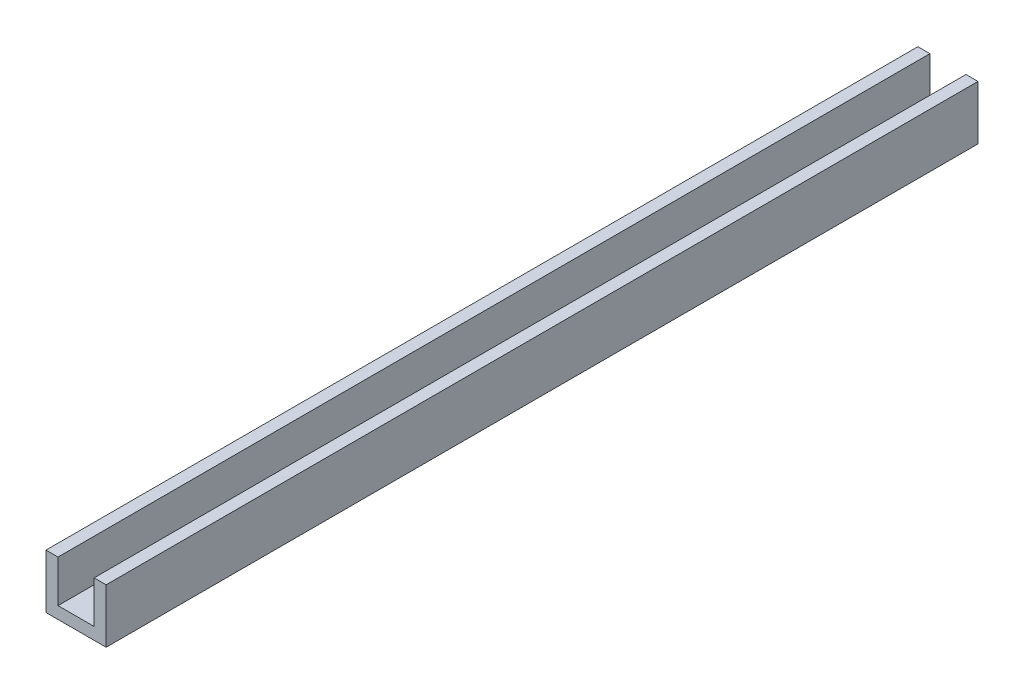
ISO-10303-21;
HEADER;
FILE_DESCRIPTION(('STEP AP214'),'2;1');
FILE_NAME('part.step','',(''),(''),'','','');
FILE_SCHEMA(('AUTOMOTIVE_DESIGN { 1 0 10303 214 1 1 1 1 }'));
ENDSEC;
DATA;
#1=APPLICATION_CONTEXT('core data for automotive mechanical design processes');
#2=APPLICATION_PROTOCOL_DEFINITION('international standard','automotive_design',2000,#1);
#3=PRODUCT_CONTEXT('',#1,'mechanical');
#4=PRODUCT('Part','Part','',(#3));
#5=PRODUCT_RELATED_PRODUCT_CATEGORY('part','',(#4));
#6=PRODUCT_DEFINITION_FORMATION('','',#4);
#7=PRODUCT_DEFINITION_CONTEXT('part definition',#1,'design');
#8=PRODUCT_DEFINITION('design','',#6,#7);
#9=PRODUCT_DEFINITION_SHAPE('','',#8);
#10=(LENGTH_UNIT() NAMED_UNIT(*) SI_UNIT(.MILLI.,.METRE.));
#11=(NAMED_UNIT(*) PLANE_ANGLE_UNIT() SI_UNIT($,.RADIAN.));
#12=(NAMED_UNIT(*) SI_UNIT($,.STERADIAN.) SOLID_ANGLE_UNIT());
#13=UNCERTAINTY_MEASURE_WITH_UNIT(LENGTH_MEASURE(1.E-05),#10,'distance_accuracy_value','');
#14=(GEOMETRIC_REPRESENTATION_CONTEXT(3) GLOBAL_UNCERTAINTY_ASSIGNED_CONTEXT((#13)) GLOBAL_UNIT_ASSIGNED_CONTEXT((#10,
#11,#12)) REPRESENTATION_CONTEXT('',''));
#15=CARTESIAN_POINT('',(0.,0.,0.));
#16=DIRECTION('',(0.,0.,1.));
#17=DIRECTION('',(1.,0.,0.));
#18=AXIS2_PLACEMENT_3D('',#15,#16,#17);
#19=CARTESIAN_POINT('',(-3.,9.,245.));
#20=DIRECTION('',(0.,-1.,0.));
#21=DIRECTION('',(0.,0.,-1.));
#22=AXIS2_PLACEMENT_3D('',#19,#20,#21);
#23=PLANE('',#22);
#24=DIRECTION('',(0.,0.,-1.));
#25=VECTOR('',#24,1.);
#26=CARTESIAN_POINT('',(-3.,9.,245.));
#27=LINE('',#26,#25);
#28=CARTESIAN_POINT('',(-3.,9.,245.));
#29=VERTEX_POINT('',#28);
#30=CARTESIAN_POINT('',(-3.,9.,100.));
#31=VERTEX_POINT('',#30);
#32=EDGE_CURVE('E175',#29,#31,#27,.T.);
#33=ORIENTED_EDGE('',*,*,#32,.T.);
#34=DIRECTION('',(-1.,0.,0.));
#35=VECTOR('',#34,1.);
#36=CARTESIAN_POINT('',(-5.00000000000001,9.,100.));
#37=LINE('',#36,#35);
#38=CARTESIAN_POINT('',(-5.00000000000001,9.,100.));
#39=VERTEX_POINT('',#38);
#40=EDGE_CURVE('E51',#31,#39,#37,.T.);
#41=ORIENTED_EDGE('',*,*,#40,.T.);
#42=DIRECTION('',(0.,0.,-1.));
#43=VECTOR('',#42,1.);
#44=CARTESIAN_POINT('',(-5.,9.,245.));
#45=LINE('',#44,#43);
#46=CARTESIAN_POINT('',(-5.,9.,245.));
#47=VERTEX_POINT('',#46);
#48=EDGE_CURVE('E44',#47,#39,#45,.T.);
#49=ORIENTED_EDGE('',*,*,#48,.F.);
#50=DIRECTION('',(-1.,0.,0.));
#51=VECTOR('',#50,1.);
#52=CARTESIAN_POINT('',(-3.,9.,245.));
#53=LINE('',#52,#51);
#54=EDGE_CURVE('E153',#29,#47,#53,.T.);
#55=ORIENTED_EDGE('',*,*,#54,.F.);
#56=EDGE_LOOP('',(#33,#41,#49,#55));
#57=FACE_BOUND('',#56,.T.);
#58=ADVANCED_FACE('F37',(#57),#23,.F.);
#59=CARTESIAN_POINT('',(-5.,9.,245.));
#60=DIRECTION('',(1.,0.,0.));
#61=DIRECTION('',(0.,1.,0.));
#62=AXIS2_PLACEMENT_3D('',#59,#60,#61);
#63=PLANE('',#62);
#64=ORIENTED_EDGE('',*,*,#48,.T.);
#65=DIRECTION('',(0.,-1.,0.));
#66=VECTOR('',#65,1.);
#67=CARTESIAN_POINT('',(-5.00000000000001,9.,100.));
#68=LINE('',#67,#66);
#69=CARTESIAN_POINT('',(-5.00000000000001,0.,100.));
#70=VERTEX_POINT('',#69);
#71=EDGE_CURVE('E120',#39,#70,#68,.T.);
#72=ORIENTED_EDGE('',*,*,#71,.T.);
#73=DIRECTION('',(0.,0.,-1.));
#74=VECTOR('',#73,1.);
#75=CARTESIAN_POINT('',(-5.,0.,245.));
#76=LINE('',#75,#74);
#77=CARTESIAN_POINT('',(-5.,0.,245.));
#78=VERTEX_POINT('',#77);
#79=EDGE_CURVE('E126',#78,#70,#76,.T.);
#80=ORIENTED_EDGE('',*,*,#79,.F.);
#81=DIRECTION('',(0.,-1.,0.));
#82=VECTOR('',#81,1.);
#83=CARTESIAN_POINT('',(-5.,9.,245.));
#84=LINE('',#83,#82);
#85=EDGE_CURVE('E156',#47,#78,#84,.T.);
#86=ORIENTED_EDGE('',*,*,#85,.F.);
#87=EDGE_LOOP('',(#64,#72,#80,#86));
#88=FACE_BOUND('',#87,.T.);
#89=ADVANCED_FACE('F217',(#88),#63,.F.);
#90=CARTESIAN_POINT('',(-5.,0.,245.));
#91=DIRECTION('',(0.,1.,0.));
#92=DIRECTION('',(0.,0.,1.));
#93=AXIS2_PLACEMENT_3D('',#90,#91,#92);
#94=PLANE('',#93);
#95=CARTESIAN_POINT('',(0.,0.,225.));
#96=DIRECTION('',(0.,-1.,0.));
#97=DIRECTION('',(0.,0.,-1.));
#98=AXIS2_PLACEMENT_3D('',#95,#96,#97);
#99=CIRCLE('',#98,2.5);
#100=CARTESIAN_POINT('',(0.,0.,222.5));
#101=VERTEX_POINT('',#100);
#102=EDGE_CURVE('E140',#101,#101,#99,.T.);
#103=ORIENTED_EDGE('',*,*,#102,.F.);
#104=EDGE_LOOP('',(#103));
#105=FACE_BOUND('',#104,.T.);
#106=CARTESIAN_POINT('',(0.,0.,161.));
#107=DIRECTION('',(0.,-1.,0.));
#108=DIRECTION('',(0.,0.,-1.));
#109=AXIS2_PLACEMENT_3D('',#106,#107,#108);
#110=CIRCLE('',#109,2.5);
#111=CARTESIAN_POINT('',(0.,0.,158.5));
#112=VERTEX_POINT('',#111);
#113=EDGE_CURVE('E191',#112,#112,#110,.T.);
#114=ORIENTED_EDGE('',*,*,#113,.F.);
#115=EDGE_LOOP('',(#114));
#116=FACE_BOUND('',#115,.T.);
#117=CARTESIAN_POINT('',(0.,0.,217.));
#118=DIRECTION('',(0.,-1.,0.));
#119=DIRECTION('',(0.,0.,-1.));
#120=AXIS2_PLACEMENT_3D('',#117,#118,#119);
#121=CIRCLE('',#120,2.5);
#122=CARTESIAN_POINT('',(0.,0.,214.5));
#123=VERTEX_POINT('',#122);
#124=EDGE_CURVE('E199',#123,#123,#121,.T.);
#125=ORIENTED_EDGE('',*,*,#124,.F.);
#126=EDGE_LOOP('',(#125));
#127=FACE_BOUND('',#126,.T.);
#128=CARTESIAN_POINT('',(0.,0.,122.5));
#129=DIRECTION('',(0.,-1.,0.));
#130=DIRECTION('',(0.,0.,-1.));
#131=AXIS2_PLACEMENT_3D('',#128,#129,#130);
#132=CIRCLE('',#131,2.5);
#133=CARTESIAN_POINT('',(0.,0.,120.));
#134=VERTEX_POINT('',#133);
#135=EDGE_CURVE('E163',#134,#134,#132,.T.);
#136=ORIENTED_EDGE('',*,*,#135,.F.);
#137=EDGE_LOOP('',(#136));
#138=FACE_BOUND('',#137,.T.);
#139=CARTESIAN_POINT('',(0.,0.,209.));
#140=DIRECTION('',(0.,-1.,0.));
#141=DIRECTION('',(0.,0.,-1.));
#142=AXIS2_PLACEMENT_3D('',#139,#140,#141);
#143=CIRCLE('',#142,2.5);
#144=CARTESIAN_POINT('',(0.,0.,206.5));
#145=VERTEX_POINT('',#144);
#146=EDGE_CURVE('E201',#145,#145,#143,.T.);
#147=ORIENTED_EDGE('',*,*,#146,.F.);
#148=EDGE_LOOP('',(#147));
#149=FACE_BOUND('',#148,.T.);
#150=CARTESIAN_POINT('',(0.,0.,193.));
#151=DIRECTION('',(0.,-1.,0.));
#152=DIRECTION('',(0.,0.,-1.));
#153=AXIS2_PLACEMENT_3D('',#150,#151,#152);
#154=CIRCLE('',#153,2.5);
#155=CARTESIAN_POINT('',(0.,0.,190.5));
#156=VERTEX_POINT('',#155);
#157=EDGE_CURVE('E194',#156,#156,#154,.T.);
#158=ORIENTED_EDGE('',*,*,#157,.F.);
#159=EDGE_LOOP('',(#158));
#160=FACE_BOUND('',#159,.T.);
#161=ORIENTED_EDGE('',*,*,#79,.T.);
#162=DIRECTION('',(-1.,0.,0.));
#163=VECTOR('',#162,1.);
#164=CARTESIAN_POINT('',(-5.00000000000001,0.,100.));
#165=LINE('',#164,#163);
#166=CARTESIAN_POINT('',(5.,0.,100.));
#167=VERTEX_POINT('',#166);
#168=EDGE_CURVE('E226',#167,#70,#165,.T.);
#169=ORIENTED_EDGE('',*,*,#168,.F.);
#170=DIRECTION('',(0.,0.,-1.));
#171=VECTOR('',#170,1.);
#172=CARTESIAN_POINT('',(5.,0.,245.));
#173=LINE('',#172,#171);
#174=CARTESIAN_POINT('',(5.,0.,245.));
#175=VERTEX_POINT('',#174);
#176=EDGE_CURVE('E119',#175,#167,#173,.T.);
#177=ORIENTED_EDGE('',*,*,#176,.F.);
#178=DIRECTION('',(1.,0.,0.));
#179=VECTOR('',#178,1.);
#180=CARTESIAN_POINT('',(-5.,0.,245.));
#181=LINE('',#180,#179);
#182=EDGE_CURVE('E160',#78,#175,#181,.T.);
#183=ORIENTED_EDGE('',*,*,#182,.F.);
#184=EDGE_LOOP('',(#161,#169,#177,#183));
#185=FACE_BOUND('',#184,.T.);
#186=ADVANCED_FACE('F214',(#105,#116,#127,#138,#149,#160,#185),#94,.F.);
#187=CARTESIAN_POINT('',(5.,0.,245.));
#188=DIRECTION('',(-1.,0.,0.));
#189=DIRECTION('',(0.,0.,1.));
#190=AXIS2_PLACEMENT_3D('',#187,#188,#189);
#191=PLANE('',#190);
#192=ORIENTED_EDGE('',*,*,#176,.T.);
#193=DIRECTION('',(0.,-1.,0.));
#194=VECTOR('',#193,1.);
#195=CARTESIAN_POINT('',(5.,9.,100.));
#196=LINE('',#195,#194);
#197=CARTESIAN_POINT('',(5.,9.,100.));
#198=VERTEX_POINT('',#197);
#199=EDGE_CURVE('E102',#198,#167,#196,.T.);
#200=ORIENTED_EDGE('',*,*,#199,.F.);
#201=DIRECTION('',(0.,0.,-1.));
#202=VECTOR('',#201,1.);
#203=CARTESIAN_POINT('',(5.,9.,245.));
#204=LINE('',#203,#202);
#205=CARTESIAN_POINT('',(5.,9.,245.));
#206=VERTEX_POINT('',#205);
#207=EDGE_CURVE('E116',#206,#198,#204,.T.);
#208=ORIENTED_EDGE('',*,*,#207,.F.);
#209=DIRECTION('',(0.,1.,0.));
#210=VECTOR('',#209,1.);
#211=CARTESIAN_POINT('',(5.,0.,245.));
#212=LINE('',#211,#210);
#213=EDGE_CURVE('E167',#175,#206,#212,.T.);
#214=ORIENTED_EDGE('',*,*,#213,.F.);
#215=EDGE_LOOP('',(#192,#200,#208,#214));
#216=FACE_BOUND('',#215,.T.);
#217=ADVANCED_FACE('F114',(#216),#191,.F.);
#218=CARTESIAN_POINT('',(5.,9.,245.));
#219=DIRECTION('',(0.,-1.,0.));
#220=DIRECTION('',(0.,0.,-1.));
#221=AXIS2_PLACEMENT_3D('',#218,#219,#220);
#222=PLANE('',#221);
#223=ORIENTED_EDGE('',*,*,#207,.T.);
#224=CARTESIAN_POINT('',(3.,9.,100.));
#225=VERTEX_POINT('',#224);
#226=EDGE_CURVE('E99',#198,#225,#37,.T.);
#227=ORIENTED_EDGE('',*,*,#226,.T.);
#228=DIRECTION('',(0.,0.,-1.));
#229=VECTOR('',#228,1.);
#230=CARTESIAN_POINT('',(3.,9.,245.));
#231=LINE('',#230,#229);
#232=CARTESIAN_POINT('',(3.,9.,245.));
#233=VERTEX_POINT('',#232);
#234=EDGE_CURVE('E124',#233,#225,#231,.T.);
#235=ORIENTED_EDGE('',*,*,#234,.F.);
#236=DIRECTION('',(-1.,0.,0.));
#237=VECTOR('',#236,1.);
#238=CARTESIAN_POINT('',(5.,9.,245.));
#239=LINE('',#238,#237);
#240=EDGE_CURVE('E123',#206,#233,#239,.T.);
#241=ORIENTED_EDGE('',*,*,#240,.F.);
#242=EDGE_LOOP('',(#223,#227,#235,#241));
#243=FACE_BOUND('',#242,.T.);
#244=ADVANCED_FACE('F122',(#243),#222,.F.);
#245=CARTESIAN_POINT('',(3.,9.,245.));
#246=DIRECTION('',(1.,0.,0.));
#247=DIRECTION('',(0.,1.,0.));
#248=AXIS2_PLACEMENT_3D('',#245,#246,#247);
#249=PLANE('',#248);
#250=ORIENTED_EDGE('',*,*,#234,.T.);
#251=DIRECTION('',(0.,-1.,0.));
#252=VECTOR('',#251,1.);
#253=CARTESIAN_POINT('',(3.,9.,100.));
#254=LINE('',#253,#252);
#255=CARTESIAN_POINT('',(3.,2.,100.));
#256=VERTEX_POINT('',#255);
#257=EDGE_CURVE('E105',#225,#256,#254,.T.);
#258=ORIENTED_EDGE('',*,*,#257,.T.);
#259=DIRECTION('',(0.,0.,-1.));
#260=VECTOR('',#259,1.);
#261=CARTESIAN_POINT('',(3.,2.,245.));
#262=LINE('',#261,#260);
#263=CARTESIAN_POINT('',(3.,2.,245.));
#264=VERTEX_POINT('',#263);
#265=EDGE_CURVE('E128',#264,#256,#262,.T.);
#266=ORIENTED_EDGE('',*,*,#265,.F.);
#267=DIRECTION('',(0.,-1.,0.));
#268=VECTOR('',#267,1.);
#269=CARTESIAN_POINT('',(3.,9.,245.));
#270=LINE('',#269,#268);
#271=EDGE_CURVE('E170',#233,#264,#270,.T.);
#272=ORIENTED_EDGE('',*,*,#271,.F.);
#273=EDGE_LOOP('',(#250,#258,#266,#272));
#274=FACE_BOUND('',#273,.T.);
#275=ADVANCED_FACE('F190',(#274),#249,.F.);
#276=CARTESIAN_POINT('',(3.,2.,245.));
#277=DIRECTION('',(0.,-1.,0.));
#278=DIRECTION('',(1.,0.,0.));
#279=AXIS2_PLACEMENT_3D('',#276,#277,#278);
#280=PLANE('',#279);
#281=CARTESIAN_POINT('',(0.,2.,225.));
#282=DIRECTION('',(0.,-1.,0.));
#283=DIRECTION('',(1.,0.,0.));
#284=AXIS2_PLACEMENT_3D('',#281,#282,#283);
#285=CIRCLE('',#284,2.5);
#286=CARTESIAN_POINT('',(2.5,2.,225.));
#287=VERTEX_POINT('',#286);
#288=EDGE_CURVE('E151',#287,#287,#285,.T.);
#289=ORIENTED_EDGE('',*,*,#288,.T.);
#290=EDGE_LOOP('',(#289));
#291=FACE_BOUND('',#290,.T.);
#292=CARTESIAN_POINT('',(0.,2.,161.));
#293=DIRECTION('',(0.,-1.,0.));
#294=DIRECTION('',(1.,0.,0.));
#295=AXIS2_PLACEMENT_3D('',#292,#293,#294);
#296=CIRCLE('',#295,2.5);
#297=CARTESIAN_POINT('',(2.5,2.,161.));
#298=VERTEX_POINT('',#297);
#299=EDGE_CURVE('E149',#298,#298,#296,.T.);
#300=ORIENTED_EDGE('',*,*,#299,.T.);
#301=EDGE_LOOP('',(#300));
#302=FACE_BOUND('',#301,.T.);
#303=CARTESIAN_POINT('',(0.,2.,217.));
#304=DIRECTION('',(0.,-1.,0.));
#305=DIRECTION('',(1.,0.,0.));
#306=AXIS2_PLACEMENT_3D('',#303,#304,#305);
#307=CIRCLE('',#306,2.5);
#308=CARTESIAN_POINT('',(2.5,2.,217.));
#309=VERTEX_POINT('',#308);
#310=EDGE_CURVE('E146',#309,#309,#307,.T.);
#311=ORIENTED_EDGE('',*,*,#310,.T.);
#312=EDGE_LOOP('',(#311));
#313=FACE_BOUND('',#312,.T.);
#314=CARTESIAN_POINT('',(0.,2.,122.5));
#315=DIRECTION('',(0.,-1.,0.));
#316=DIRECTION('',(1.,0.,0.));
#317=AXIS2_PLACEMENT_3D('',#314,#315,#316);
#318=CIRCLE('',#317,2.5);
#319=CARTESIAN_POINT('',(2.5,2.,122.5));
#320=VERTEX_POINT('',#319);
#321=EDGE_CURVE('E143',#320,#320,#318,.T.);
#322=ORIENTED_EDGE('',*,*,#321,.T.);
#323=EDGE_LOOP('',(#322));
#324=FACE_BOUND('',#323,.T.);
#325=CARTESIAN_POINT('',(0.,2.,209.));
#326=DIRECTION('',(0.,-1.,0.));
#327=DIRECTION('',(1.,0.,0.));
#328=AXIS2_PLACEMENT_3D('',#325,#326,#327);
#329=CIRCLE('',#328,2.5);
#330=CARTESIAN_POINT('',(2.5,2.,209.));
#331=VERTEX_POINT('',#330);
#332=EDGE_CURVE('E139',#331,#331,#329,.T.);
#333=ORIENTED_EDGE('',*,*,#332,.T.);
#334=EDGE_LOOP('',(#333));
#335=FACE_BOUND('',#334,.T.);
#336=CARTESIAN_POINT('',(0.,2.,193.));
#337=DIRECTION('',(0.,-1.,0.));
#338=DIRECTION('',(1.,0.,0.));
#339=AXIS2_PLACEMENT_3D('',#336,#337,#338);
#340=CIRCLE('',#339,2.5);
#341=CARTESIAN_POINT('',(2.5,2.,193.));
#342=VERTEX_POINT('',#341);
#343=EDGE_CURVE('E136',#342,#342,#340,.T.);
#344=ORIENTED_EDGE('',*,*,#343,.T.);
#345=EDGE_LOOP('',(#344));
#346=FACE_BOUND('',#345,.T.);
#347=ORIENTED_EDGE('',*,*,#265,.T.);
#348=DIRECTION('',(-1.,0.,0.));
#349=VECTOR('',#348,1.);
#350=CARTESIAN_POINT('',(3.,2.,100.));
#351=LINE('',#350,#349);
#352=CARTESIAN_POINT('',(-3.,2.,100.));
#353=VERTEX_POINT('',#352);
#354=EDGE_CURVE('E187',#256,#353,#351,.T.);
#355=ORIENTED_EDGE('',*,*,#354,.T.);
#356=DIRECTION('',(0.,0.,-1.));
#357=VECTOR('',#356,1.);
#358=CARTESIAN_POINT('',(-3.,2.,245.));
#359=LINE('',#358,#357);
#360=CARTESIAN_POINT('',(-3.,2.,245.));
#361=VERTEX_POINT('',#360);
#362=EDGE_CURVE('E178',#361,#353,#359,.T.);
#363=ORIENTED_EDGE('',*,*,#362,.F.);
#364=DIRECTION('',(-1.,0.,0.));
#365=VECTOR('',#364,1.);
#366=CARTESIAN_POINT('',(3.,2.,245.));
#367=LINE('',#366,#365);
#368=EDGE_CURVE('E172',#264,#361,#367,.T.);
#369=ORIENTED_EDGE('',*,*,#368,.F.);
#370=EDGE_LOOP('',(#347,#355,#363,#369));
#371=FACE_BOUND('',#370,.T.);
#372=ADVANCED_FACE('F185',(#291,#302,#313,#324,#335,#346,#371),#280,.F.);
#373=CARTESIAN_POINT('',(-3.,2.,245.));
#374=DIRECTION('',(-1.,0.,0.));
#375=DIRECTION('',(0.,0.,1.));
#376=AXIS2_PLACEMENT_3D('',#373,#374,#375);
#377=PLANE('',#376);
#378=ORIENTED_EDGE('',*,*,#362,.T.);
#379=DIRECTION('',(0.,1.,0.));
#380=VECTOR('',#379,1.);
#381=CARTESIAN_POINT('',(-3.,2.,100.));
#382=LINE('',#381,#380);
#383=EDGE_CURVE('E11',#353,#31,#382,.T.);
#384=ORIENTED_EDGE('',*,*,#383,.T.);
#385=ORIENTED_EDGE('',*,*,#32,.F.);
#386=DIRECTION('',(0.,1.,0.));
#387=VECTOR('',#386,1.);
#388=CARTESIAN_POINT('',(-3.,2.,245.));
#389=LINE('',#388,#387);
#390=EDGE_CURVE('E58',#361,#29,#389,.T.);
#391=ORIENTED_EDGE('',*,*,#390,.F.);
#392=EDGE_LOOP('',(#378,#384,#385,#391));
#393=FACE_BOUND('',#392,.T.);
#394=ADVANCED_FACE('F233',(#393),#377,.F.);
#395=CARTESIAN_POINT('',(0.,0.,245.));
#396=DIRECTION('',(0.,0.,1.));
#397=DIRECTION('',(1.,0.,0.));
#398=AXIS2_PLACEMENT_3D('',#395,#396,#397);
#399=PLANE('',#398);
#400=ORIENTED_EDGE('',*,*,#54,.T.);
#401=ORIENTED_EDGE('',*,*,#85,.T.);
#402=ORIENTED_EDGE('',*,*,#182,.T.);
#403=ORIENTED_EDGE('',*,*,#213,.T.);
#404=ORIENTED_EDGE('',*,*,#240,.T.);
#405=ORIENTED_EDGE('',*,*,#271,.T.);
#406=ORIENTED_EDGE('',*,*,#368,.T.);
#407=ORIENTED_EDGE('',*,*,#390,.T.);
#408=EDGE_LOOP('',(#400,#401,#402,#403,#404,#405,#406,#407));
#409=FACE_BOUND('',#408,.T.);
#410=ADVANCED_FACE('F235',(#409),#399,.T.);
#411=CARTESIAN_POINT('',(0.,9.,193.));
#412=DIRECTION('',(0.,-1.,0.));
#413=DIRECTION('',(0.,0.,-1.));
#414=AXIS2_PLACEMENT_3D('',#411,#412,#413);
#415=CYLINDRICAL_SURFACE('',#414,2.5);
#416=ORIENTED_EDGE('',*,*,#157,.T.);
#417=EDGE_LOOP('',(#416));
#418=FACE_BOUND('',#417,.T.);
#419=ORIENTED_EDGE('',*,*,#343,.F.);
#420=EDGE_LOOP('',(#419));
#421=FACE_BOUND('',#420,.T.);
#422=ADVANCED_FACE('F241',(#418,#421),#415,.F.);
#423=CARTESIAN_POINT('',(0.,9.,209.));
#424=DIRECTION('',(0.,-1.,0.));
#425=DIRECTION('',(0.,0.,-1.));
#426=AXIS2_PLACEMENT_3D('',#423,#424,#425);
#427=CYLINDRICAL_SURFACE('',#426,2.5);
#428=ORIENTED_EDGE('',*,*,#146,.T.);
#429=EDGE_LOOP('',(#428));
#430=FACE_BOUND('',#429,.T.);
#431=ORIENTED_EDGE('',*,*,#332,.F.);
#432=EDGE_LOOP('',(#431));
#433=FACE_BOUND('',#432,.T.);
#434=ADVANCED_FACE('F311',(#430,#433),#427,.F.);
#435=CARTESIAN_POINT('',(0.,9.,122.5));
#436=DIRECTION('',(0.,-1.,0.));
#437=DIRECTION('',(0.,0.,-1.));
#438=AXIS2_PLACEMENT_3D('',#435,#436,#437);
#439=CYLINDRICAL_SURFACE('',#438,2.5);
#440=ORIENTED_EDGE('',*,*,#135,.T.);
#441=EDGE_LOOP('',(#440));
#442=FACE_BOUND('',#441,.T.);
#443=ORIENTED_EDGE('',*,*,#321,.F.);
#444=EDGE_LOOP('',(#443));
#445=FACE_BOUND('',#444,.T.);
#446=ADVANCED_FACE('F211',(#442,#445),#439,.F.);
#447=CARTESIAN_POINT('',(0.,9.,217.));
#448=DIRECTION('',(0.,-1.,0.));
#449=DIRECTION('',(0.,0.,-1.));
#450=AXIS2_PLACEMENT_3D('',#447,#448,#449);
#451=CYLINDRICAL_SURFACE('',#450,2.5);
#452=ORIENTED_EDGE('',*,*,#124,.T.);
#453=EDGE_LOOP('',(#452));
#454=FACE_BOUND('',#453,.T.);
#455=ORIENTED_EDGE('',*,*,#310,.F.);
#456=EDGE_LOOP('',(#455));
#457=FACE_BOUND('',#456,.T.);
#458=ADVANCED_FACE('F297',(#454,#457),#451,.F.);
#459=CARTESIAN_POINT('',(0.,9.,161.));
#460=DIRECTION('',(0.,-1.,0.));
#461=DIRECTION('',(0.,0.,-1.));
#462=AXIS2_PLACEMENT_3D('',#459,#460,#461);
#463=CYLINDRICAL_SURFACE('',#462,2.5);
#464=ORIENTED_EDGE('',*,*,#113,.T.);
#465=EDGE_LOOP('',(#464));
#466=FACE_BOUND('',#465,.T.);
#467=ORIENTED_EDGE('',*,*,#299,.F.);
#468=EDGE_LOOP('',(#467));
#469=FACE_BOUND('',#468,.T.);
#470=ADVANCED_FACE('F290',(#466,#469),#463,.F.);
#471=CARTESIAN_POINT('',(0.,9.,225.));
#472=DIRECTION('',(0.,-1.,0.));
#473=DIRECTION('',(0.,0.,-1.));
#474=AXIS2_PLACEMENT_3D('',#471,#472,#473);
#475=CYLINDRICAL_SURFACE('',#474,2.5);
#476=ORIENTED_EDGE('',*,*,#102,.T.);
#477=EDGE_LOOP('',(#476));
#478=FACE_BOUND('',#477,.T.);
#479=ORIENTED_EDGE('',*,*,#288,.F.);
#480=EDGE_LOOP('',(#479));
#481=FACE_BOUND('',#480,.T.);
#482=ADVANCED_FACE('F279',(#478,#481),#475,.F.);
#483=CARTESIAN_POINT('',(-5.00000000000001,9.,100.));
#484=DIRECTION('',(0.,0.,1.));
#485=DIRECTION('',(1.,0.,0.));
#486=AXIS2_PLACEMENT_3D('',#483,#484,#485);
#487=PLANE('',#486);
#488=ORIENTED_EDGE('',*,*,#226,.F.);
#489=ORIENTED_EDGE('',*,*,#199,.T.);
#490=ORIENTED_EDGE('',*,*,#168,.T.);
#491=ORIENTED_EDGE('',*,*,#71,.F.);
#492=ORIENTED_EDGE('',*,*,#40,.F.);
#493=ORIENTED_EDGE('',*,*,#383,.F.);
#494=ORIENTED_EDGE('',*,*,#354,.F.);
#495=ORIENTED_EDGE('',*,*,#257,.F.);
#496=EDGE_LOOP('',(#488,#489,#490,#491,#492,#493,#494,#495));
#497=FACE_BOUND('',#496,.T.);
#498=ADVANCED_FACE('F101',(#497),#487,.F.);
#499=CLOSED_SHELL('',(#58,#89,#186,#217,#244,#275,#372,#394,#410,#422,#434,#446,#458,#470,#482,#498));
#500=MANIFOLD_SOLID_BREP('B2',#499);
#501=ADVANCED_BREP_SHAPE_REPRESENTATION('',(#18,#500),#14);
#502=SHAPE_DEFINITION_REPRESENTATION(#9,#501);
ENDSEC;
END-ISO-10303-21;
